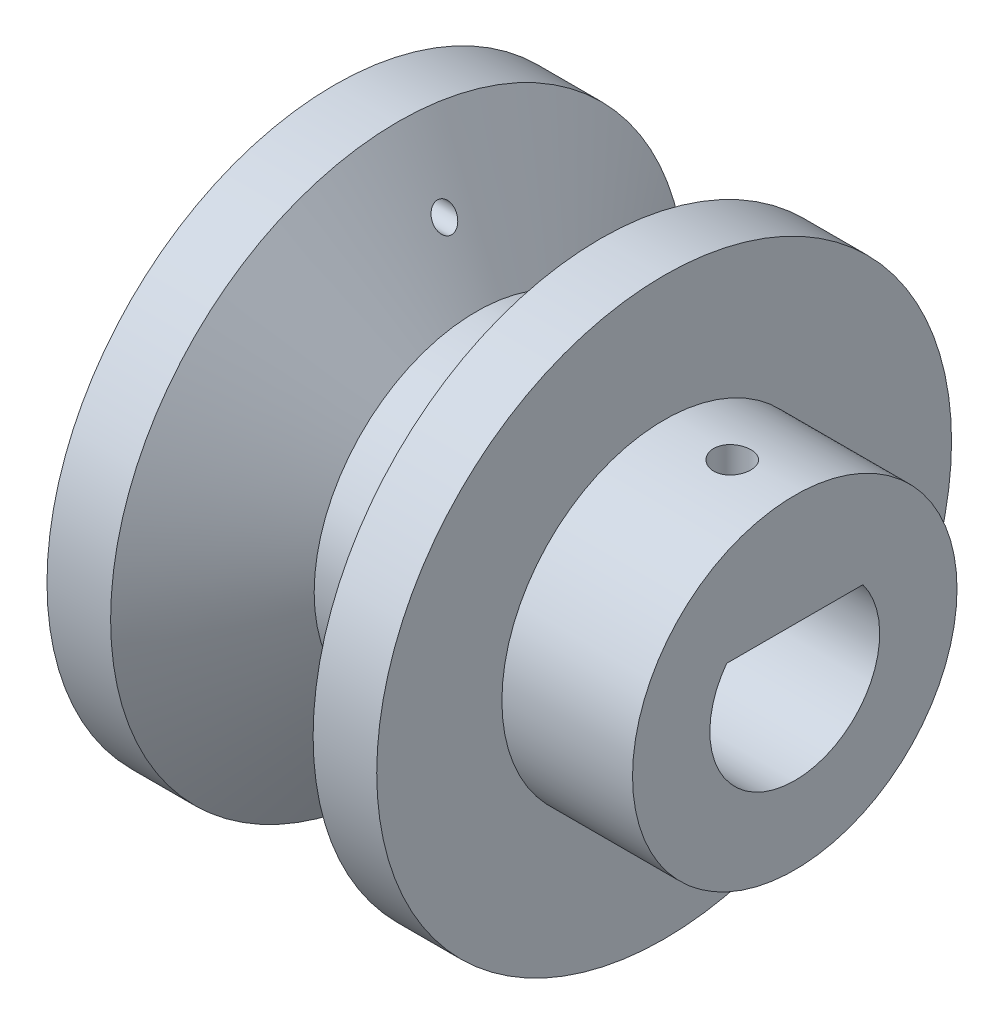
ISO-10303-21;
HEADER;
FILE_DESCRIPTION(('STEP AP214'),'2;1');
FILE_NAME('part.step','',(''),(''),'','','');
FILE_SCHEMA(('AUTOMOTIVE_DESIGN { 1 0 10303 214 1 1 1 1 }'));
ENDSEC;
DATA;
#1=APPLICATION_CONTEXT('core data for automotive mechanical design processes');
#2=APPLICATION_PROTOCOL_DEFINITION('international standard','automotive_design',2000,#1);
#3=PRODUCT_CONTEXT('',#1,'mechanical');
#4=PRODUCT('Part','Part','',(#3));
#5=PRODUCT_RELATED_PRODUCT_CATEGORY('part','',(#4));
#6=PRODUCT_DEFINITION_FORMATION('','',#4);
#7=PRODUCT_DEFINITION_CONTEXT('part definition',#1,'design');
#8=PRODUCT_DEFINITION('design','',#6,#7);
#9=PRODUCT_DEFINITION_SHAPE('','',#8);
#10=(LENGTH_UNIT() NAMED_UNIT(*) SI_UNIT(.MILLI.,.METRE.));
#11=(NAMED_UNIT(*) PLANE_ANGLE_UNIT() SI_UNIT($,.RADIAN.));
#12=(NAMED_UNIT(*) SI_UNIT($,.STERADIAN.) SOLID_ANGLE_UNIT());
#13=UNCERTAINTY_MEASURE_WITH_UNIT(LENGTH_MEASURE(1.E-05),#10,'distance_accuracy_value','');
#14=(GEOMETRIC_REPRESENTATION_CONTEXT(3) GLOBAL_UNCERTAINTY_ASSIGNED_CONTEXT((#13)) GLOBAL_UNIT_ASSIGNED_CONTEXT((#10,
#11,#12)) REPRESENTATION_CONTEXT('',''));
#15=CARTESIAN_POINT('',(0.,0.,0.));
#16=DIRECTION('',(0.,0.,1.));
#17=DIRECTION('',(1.,0.,0.));
#18=AXIS2_PLACEMENT_3D('',#15,#16,#17);
#19=CARTESIAN_POINT('',(-743.156397809563,0.,0.));
#20=DIRECTION('',(-1.,0.,0.));
#21=DIRECTION('',(0.,0.,1.));
#22=AXIS2_PLACEMENT_3D('',#19,#20,#21);
#23=CYLINDRICAL_SURFACE('',#22,12.4188584474886);
#24=CARTESIAN_POINT('',(25.24,0.,0.));
#25=DIRECTION('',(-1.,0.,0.));
#26=DIRECTION('',(0.,0.,1.));
#27=AXIS2_PLACEMENT_3D('',#24,#25,#26);
#28=CIRCLE('',#27,12.4188584474886);
#29=CARTESIAN_POINT('',(25.24,0.,12.4188584474886));
#30=VERTEX_POINT('',#29);
#31=EDGE_CURVE('E118',#30,#30,#28,.T.);
#32=ORIENTED_EDGE('',*,*,#31,.F.);
#33=EDGE_LOOP('',(#32));
#34=FACE_BOUND('',#33,.T.);
#35=CARTESIAN_POINT('',(35.2400000000001,0.,0.));
#36=DIRECTION('',(-1.,0.,0.));
#37=DIRECTION('',(0.,0.,1.));
#38=AXIS2_PLACEMENT_3D('',#35,#36,#37);
#39=CIRCLE('',#38,12.4188584474886);
#40=CARTESIAN_POINT('',(35.2400000000001,0.,12.4188584474886));
#41=VERTEX_POINT('',#40);
#42=EDGE_CURVE('E67',#41,#41,#39,.T.);
#43=ORIENTED_EDGE('',*,*,#42,.T.);
#44=EDGE_LOOP('',(#43));
#45=FACE_BOUND('',#44,.T.);
#46=CARTESIAN_POINT('',(30.4564854289592,12.3368318517665,-1.425));
#47=CARTESIAN_POINT('',(30.3767257499112,12.3368329133711,-1.42499657940768));
#48=CARTESIAN_POINT('',(30.2969149572835,12.3376136863085,-1.41828099475576));
#49=CARTESIAN_POINT('',(30.1395108596578,12.3406515638596,-1.39159530948965));
#50=CARTESIAN_POINT('',(30.0619200198907,12.3429102479605,-1.37161102789085));
#51=CARTESIAN_POINT('',(29.9112577874303,12.3486448171361,-1.31898166289413));
#52=CARTESIAN_POINT('',(29.8381835059513,12.3521199145139,-1.28634477131499));
#53=CARTESIAN_POINT('',(29.6985640561898,12.3598947973339,-1.20935341554239));
#54=CARTESIAN_POINT('',(29.6320176961543,12.3641944318215,-1.16500109562542));
#55=CARTESIAN_POINT('',(29.5070131445111,12.3731567524271,-1.06561248032776));
#56=CARTESIAN_POINT('',(29.4485903258798,12.3778208961618,-1.01053182188644));
#57=CARTESIAN_POINT('',(29.3417964245483,12.3869735478217,-0.891345331523106));
#58=CARTESIAN_POINT('',(29.2934258240568,12.3914620473129,-0.82723906688658));
#59=CARTESIAN_POINT('',(29.2079842957793,12.3997724055645,-0.691600902812646));
#60=CARTESIAN_POINT('',(29.1709451119469,12.4035923789432,-0.620048881804373));
#61=CARTESIAN_POINT('',(29.1094210305223,12.4101193173047,-0.471689370812507));
#62=CARTESIAN_POINT('',(29.0849357370614,12.412826317383,-0.39488204663382));
#63=CARTESIAN_POINT('',(29.0493194313203,12.4168120500806,-0.2385524353859));
#64=CARTESIAN_POINT('',(29.0381298619549,12.4180970437743,-0.159043651449833));
#65=CARTESIAN_POINT('',(29.0292412844435,12.4191153254379,0.00073293853604236));
#66=CARTESIAN_POINT('',(29.0315418244897,12.4188486653754,0.0810007190758064));
#67=CARTESIAN_POINT('',(29.0495209710596,12.4167987754947,0.239618781276121));
#68=CARTESIAN_POINT('',(29.0651366061689,12.4150226843971,0.317976305856592));
#69=CARTESIAN_POINT('',(29.1092043815446,12.4101615872632,0.470951088795022));
#70=CARTESIAN_POINT('',(29.1376567328166,12.407076559711,0.545568285648308));
#71=CARTESIAN_POINT('',(29.2066581539982,12.3999320078828,0.689140804027382));
#72=CARTESIAN_POINT('',(29.247234743039,12.3958702708476,0.758082785188274));
#73=CARTESIAN_POINT('',(29.3393128188616,12.3872273142073,0.88820232006709));
#74=CARTESIAN_POINT('',(29.3908147279536,12.3826460745244,0.94937957349907));
#75=CARTESIAN_POINT('',(29.5036348311036,12.3734462821445,1.06260252715065));
#76=CARTESIAN_POINT('',(29.5650078626871,12.3688276665266,1.11459359518068));
#77=CARTESIAN_POINT('',(29.695638917748,12.360099835848,1.20754445906353));
#78=CARTESIAN_POINT('',(29.7648969594604,12.3559906219654,1.24850422940446));
#79=CARTESIAN_POINT('',(29.9093778038213,12.3487467491065,1.31823143785395));
#80=CARTESIAN_POINT('',(29.9846025237183,12.3456124049862,1.34699493799039));
#81=CARTESIAN_POINT('',(30.1388580694797,12.3406794798589,1.39146695547265));
#82=CARTESIAN_POINT('',(30.2178887414818,12.3388808449016,1.40717600009979));
#83=CARTESIAN_POINT('',(30.3770315604316,12.3368326501637,1.42502174201459));
#84=CARTESIAN_POINT('',(30.4571349998753,12.3365743380775,1.42723512494755));
#85=CARTESIAN_POINT('',(30.6165715697792,12.3376129137197,1.41822863883146));
#86=CARTESIAN_POINT('',(30.6959047139934,12.3389097736282,1.40700901007953));
#87=CARTESIAN_POINT('',(30.8513216583303,12.3429045962443,1.37151937565863));
#88=CARTESIAN_POINT('',(30.9274139607357,12.3455986125934,1.34728612101101));
#89=CARTESIAN_POINT('',(31.0744544808436,12.3520810053482,1.2864948213467));
#90=CARTESIAN_POINT('',(31.1454025449013,12.3558694144237,1.24993640839458));
#91=CARTESIAN_POINT('',(31.2804887159006,12.3641348038081,1.16534245351547));
#92=CARTESIAN_POINT('',(31.3445950000162,12.3686147832308,1.11725639215174));
#93=CARTESIAN_POINT('',(31.4638540427252,12.3777489518294,1.01104397454608));
#94=CARTESIAN_POINT('',(31.5190065085811,12.3824031466951,0.952917290162512));
#95=CARTESIAN_POINT('',(31.6190595691407,12.391388028001,0.827939639666356));
#96=CARTESIAN_POINT('',(31.6639099315959,12.3957170628172,0.761048323719448));
#97=CARTESIAN_POINT('',(31.7417389129453,12.4035394603605,0.620637767626422));
#98=CARTESIAN_POINT('',(31.7747177383595,12.4070328376246,0.547118642807097));
#99=CARTESIAN_POINT('',(31.8277835988038,12.4127829306566,0.395709993026882));
#100=CARTESIAN_POINT('',(31.8479002338612,12.4150424840855,0.317830954505692));
#101=CARTESIAN_POINT('',(31.8747671119726,12.4180820657931,0.159773113564102));
#102=CARTESIAN_POINT('',(31.8815178582977,12.4188621497788,0.079594397849697));
#103=CARTESIAN_POINT('',(31.8814529500091,12.4188547393977,-0.0802950885669404));
#104=CARTESIAN_POINT('',(31.8747149767885,12.4180762210039,-0.160005902480762));
#105=CARTESIAN_POINT('',(31.8480277094297,12.415056853226,-0.317154733881952));
#106=CARTESIAN_POINT('',(31.8280784150618,12.4128160038164,-0.394592751329819));
#107=CARTESIAN_POINT('',(31.7755579684493,12.4071227858608,-0.544991747047911));
#108=CARTESIAN_POINT('',(31.7429899181853,12.4036707150804,-0.617953820506268));
#109=CARTESIAN_POINT('',(31.6661645255443,12.3959384159516,-0.75738886621984));
#110=CARTESIAN_POINT('',(31.6219071336962,12.3916581840982,-0.823861811010476));
#111=CARTESIAN_POINT('',(31.5226700027382,12.3827186423284,-0.948829254199049));
#112=CARTESIAN_POINT('',(31.467632389497,12.3780573691765,-1.00727765604996));
#113=CARTESIAN_POINT('',(31.3485155397673,12.3688972621374,-1.11414098134163));
#114=CARTESIAN_POINT('',(31.2844341537388,12.3643984671886,-1.16255351266552));
#115=CARTESIAN_POINT('',(31.1488121221897,12.3560569873039,-1.248102567477));
#116=CARTESIAN_POINT('',(31.0772477565124,12.3522164972766,-1.28520167836356));
#117=CARTESIAN_POINT('',(30.928903351869,12.345652310071,-1.34680458360956));
#118=CARTESIAN_POINT('',(30.8521291845959,12.3429273791966,-1.3713222993735));
#119=CARTESIAN_POINT('',(30.7218648912295,12.3395757069605,-1.40108938447031));
#120=CARTESIAN_POINT('',(30.6692015891652,12.3385517715773,-1.41004325414405));
#121=CARTESIAN_POINT('',(30.5631949591413,12.3371794908549,-1.42199968838362));
#122=CARTESIAN_POINT('',(30.5098516352658,12.33683114146,-1.42500228867566));
#123=CARTESIAN_POINT('',(30.4564854289592,12.3368318517665,-1.425));
#124=B_SPLINE_CURVE_WITH_KNOTS('',3,(#46,#47,#48,#49,#50,#51,#52,#53,#54,#55,#56,#57,#58,#59,
#60,#61,#62,#63,#64,#65,#66,#67,#68,#69,#70,#71,#72,#73,#74,#75,#76,#77,#78,#79,#80,#81,#82,#83,
#84,#85,#86,#87,#88,#89,#90,#91,#92,#93,#94,#95,#96,#97,#98,#99,#100,#101,#102,#103,#104,#105,
#106,#107,#108,#109,#110,#111,#112,#113,#114,#115,#116,#117,#118,#119,#120,#121,#122,#123),
.UNSPECIFIED.,.T.,.F.,(4,2,2,2,2,2,2,2,2,2,2,2,2,2,2,2,2,2,2,2,2,2,2,2,2,2,2,2,2,2,2,2,2,2,2,2,
2,2,4),(0.,0.239084113970291,0.47842416244864,0.717609510454033,0.956751110629616,
1.19690343157921,1.43706727007133,1.67789787209591,1.91872087941136,2.15847927458442,
2.39822963986687,2.6368523968479,2.87547907637379,3.11465154999251,3.35383327033116,
3.59439279236069,3.83495287072291,4.07559056288234,4.31621853499452,4.55547791628173,
4.79473301762935,5.03331597870293,5.27190606267891,5.51156151327294,5.75122479762523,
5.99203296450881,6.2328369420327,6.47308473854736,6.71332348874382,6.9521826866107,
7.19104188862912,7.42984241077516,7.66864394357645,7.90876448490876,8.14894219493541,
8.38990574984684,8.63060209878421,8.79057125735737,8.95053945561286),.UNSPECIFIED.);
#125=CARTESIAN_POINT('',(30.4564854289592,12.3368318517665,-1.425));
#126=VERTEX_POINT('',#125);
#127=EDGE_CURVE('E74',#126,#126,#124,.T.);
#128=ORIENTED_EDGE('',*,*,#127,.F.);
#129=EDGE_LOOP('',(#128));
#130=FACE_BOUND('',#129,.T.);
#131=ADVANCED_FACE('F32',(#34,#45,#130),#23,.T.);
#132=CARTESIAN_POINT('',(0.23999999999999,0.,0.));
#133=DIRECTION('',(1.,0.,0.));
#134=DIRECTION('',(0.,0.,-1.));
#135=AXIS2_PLACEMENT_3D('',#132,#133,#134);
#136=CYLINDRICAL_SURFACE('',#135,6.5);
#137=CARTESIAN_POINT('',(35.24,0.,0.));
#138=DIRECTION('',(1.,0.,0.));
#139=DIRECTION('',(0.,0.,-1.));
#140=AXIS2_PLACEMENT_3D('',#137,#138,#139);
#141=CIRCLE('',#140,6.5);
#142=CARTESIAN_POINT('',(35.24,3.88253725690177,5.21305135681298));
#143=VERTEX_POINT('',#142);
#144=CARTESIAN_POINT('',(35.24,3.88253725690177,-5.21305135681298));
#145=VERTEX_POINT('',#144);
#146=EDGE_CURVE('E57',#143,#145,#141,.T.);
#147=ORIENTED_EDGE('',*,*,#146,.T.);
#148=DIRECTION('',(1.,0.,0.));
#149=VECTOR('',#148,1.);
#150=CARTESIAN_POINT('',(0.23999999999999,3.88253725690177,-5.21305135681298));
#151=LINE('',#150,#149);
#152=CARTESIAN_POINT('',(0.23999999999999,3.88253725690177,-5.21305135681298));
#153=VERTEX_POINT('',#152);
#154=EDGE_CURVE('E69',#145,#153,#151,.F.);
#155=ORIENTED_EDGE('',*,*,#154,.T.);
#156=CARTESIAN_POINT('',(0.23999999999999,0.,0.));
#157=DIRECTION('',(1.,0.,0.));
#158=DIRECTION('',(0.,0.,-1.));
#159=AXIS2_PLACEMENT_3D('',#156,#157,#158);
#160=CIRCLE('',#159,6.5);
#161=CARTESIAN_POINT('',(0.23999999999999,3.88253725690177,5.21305135681298));
#162=VERTEX_POINT('',#161);
#163=EDGE_CURVE('E65',#162,#153,#160,.T.);
#164=ORIENTED_EDGE('',*,*,#163,.F.);
#165=DIRECTION('',(1.,0.,0.));
#166=VECTOR('',#165,1.);
#167=CARTESIAN_POINT('',(0.23999999999999,3.88253725690177,5.21305135681298));
#168=LINE('',#167,#166);
#169=EDGE_CURVE('E53',#162,#143,#168,.T.);
#170=ORIENTED_EDGE('',*,*,#169,.T.);
#171=EDGE_LOOP('',(#147,#155,#164,#170));
#172=FACE_BOUND('',#171,.T.);
#173=ADVANCED_FACE('F70',(#172),#136,.F.);
#174=CARTESIAN_POINT('',(0.,0.,0.));
#175=DIRECTION('',(1.,0.,0.));
#176=DIRECTION('',(0.,0.,-1.));
#177=AXIS2_PLACEMENT_3D('',#174,#175,#176);
#178=PLANE('',#177);
#179=CARTESIAN_POINT('',(0.,17.0038882596721,-0.435299539447605));
#180=DIRECTION('',(-1.,0.,0.));
#181=DIRECTION('',(0.,0.,1.));
#182=AXIS2_PLACEMENT_3D('',#179,#180,#181);
#183=CIRCLE('',#182,0.877374271185562);
#184=CARTESIAN_POINT('',(0.,17.0038882596721,0.442074731737957));
#185=VERTEX_POINT('',#184);
#186=EDGE_CURVE('E128',#185,#185,#183,.T.);
#187=ORIENTED_EDGE('',*,*,#186,.F.);
#188=EDGE_LOOP('',(#187));
#189=FACE_BOUND('',#188,.T.);
#190=CARTESIAN_POINT('',(0.,0.,0.));
#191=DIRECTION('',(-1.,0.,0.));
#192=DIRECTION('',(0.,0.,1.));
#193=AXIS2_PLACEMENT_3D('',#190,#191,#192);
#194=CIRCLE('',#193,22.);
#195=CARTESIAN_POINT('',(0.,0.,22.));
#196=VERTEX_POINT('',#195);
#197=EDGE_CURVE('E45',#196,#196,#194,.T.);
#198=ORIENTED_EDGE('',*,*,#197,.T.);
#199=EDGE_LOOP('',(#198));
#200=FACE_BOUND('',#199,.T.);
#201=ADVANCED_FACE('F34',(#189,#200),#178,.F.);
#202=CARTESIAN_POINT('',(-743.156397809563,0.,0.));
#203=DIRECTION('',(-1.,0.,0.));
#204=DIRECTION('',(0.,0.,1.));
#205=AXIS2_PLACEMENT_3D('',#202,#203,#204);
#206=CYLINDRICAL_SURFACE('',#205,22.);
#207=ORIENTED_EDGE('',*,*,#197,.F.);
#208=EDGE_LOOP('',(#207));
#209=FACE_BOUND('',#208,.T.);
#210=CARTESIAN_POINT('',(4.87000000000004,0.,0.));
#211=DIRECTION('',(-1.,0.,0.));
#212=DIRECTION('',(0.,0.,1.));
#213=AXIS2_PLACEMENT_3D('',#210,#211,#212);
#214=CIRCLE('',#213,22.);
#215=CARTESIAN_POINT('',(4.87000000000004,0.,22.));
#216=VERTEX_POINT('',#215);
#217=EDGE_CURVE('E132',#216,#216,#214,.T.);
#218=ORIENTED_EDGE('',*,*,#217,.T.);
#219=EDGE_LOOP('',(#218));
#220=FACE_BOUND('',#219,.T.);
#221=ADVANCED_FACE('F168',(#209,#220),#206,.T.);
#222=CARTESIAN_POINT('',(10.87,0.,0.));
#223=DIRECTION('',(-1.,0.,0.));
#224=DIRECTION('',(0.,0.,1.));
#225=AXIS2_PLACEMENT_3D('',#222,#223,#224);
#226=CONICAL_SURFACE('',#225,12.4188584474886,1.01131287661841);
#227=CARTESIAN_POINT('',(7.57710064935121,17.6469899885848,-1.0321293125052));
#228=CARTESIAN_POINT('',(7.59858696970687,17.6103093572041,-1.07165012340615));
#229=CARTESIAN_POINT('',(7.62208547211646,17.570493891253,-1.10722647006451));
#230=CARTESIAN_POINT('',(7.67211574976536,17.4863575017174,-1.16999423439249));
#231=CARTESIAN_POINT('',(7.69865373989293,17.4420273681804,-1.19716803614218));
#232=CARTESIAN_POINT('',(7.7537178680254,17.3506790615454,-1.24283461884535));
#233=CARTESIAN_POINT('',(7.7822317512725,17.3036777343423,-1.26137621827307));
#234=CARTESIAN_POINT('',(7.84063094326776,17.2080482814304,-1.29004924996073));
#235=CARTESIAN_POINT('',(7.87051579202427,17.1594207028306,-1.30018348162644));
#236=CARTESIAN_POINT('',(7.9345889447417,17.0558396084734,-1.31286398770481));
#237=CARTESIAN_POINT('',(7.96886969232172,17.0008153123109,-1.31437651309146));
#238=CARTESIAN_POINT('',(8.0375102749212,16.8914365160545,-1.30716416879393));
#239=CARTESIAN_POINT('',(8.07187015314245,16.8370826542982,-1.2984302048489));
#240=CARTESIAN_POINT('',(8.14175788271561,16.7273328415289,-1.26998626133393));
#241=CARTESIAN_POINT('',(8.17723632786973,16.6720622102294,-1.24966357055881));
#242=CARTESIAN_POINT('',(8.24606670152021,16.565678611003,-1.19770038677462));
#243=CARTESIAN_POINT('',(8.27942078309851,16.5145614185143,-1.16607157492409));
#244=CARTESIAN_POINT('',(8.33585911246015,16.428780982538,-1.09962176736246));
#245=CARTESIAN_POINT('',(8.35961996463377,16.392928982425,-1.0669056020117));
#246=CARTESIAN_POINT('',(8.40409237990411,16.3263132496161,-0.994836558175923));
#247=CARTESIAN_POINT('',(8.42480501157602,16.2955477333484,-0.955486015847686));
#248=CARTESIAN_POINT('',(8.46234495671956,16.2402844415044,-0.870373471187866));
#249=CARTESIAN_POINT('',(8.47913899447736,16.2158401675624,-0.824561508898873));
#250=CARTESIAN_POINT('',(8.50751309777022,16.1751081791058,-0.727953349369449));
#251=CARTESIAN_POINT('',(8.51909933119994,16.1588108131707,-0.677163135495156));
#252=CARTESIAN_POINT('',(8.53488094318649,16.1373447706426,-0.580161290511711));
#253=CARTESIAN_POINT('',(8.53990959326869,16.1308968261673,-0.534366853182571));
#254=CARTESIAN_POINT('',(8.54514520828514,16.1253259133949,-0.442070829258393));
#255=CARTESIAN_POINT('',(8.54535555018206,16.1261978143204,-0.395569760787498));
#256=CARTESIAN_POINT('',(8.541173254549,16.1347714102407,-0.308212439494241));
#257=CARTESIAN_POINT('',(8.53724514153672,16.1417716835689,-0.267261878949982));
#258=CARTESIAN_POINT('',(8.52572113922937,16.1613015180637,-0.187249414051404));
#259=CARTESIAN_POINT('',(8.51812522544573,16.1738311161475,-0.148187522308952));
#260=CARTESIAN_POINT('',(8.49946671631706,16.2041463988323,-0.0721051969150272));
#261=CARTESIAN_POINT('',(8.48833748769769,16.2220327014612,-0.0351416028744495));
#262=CARTESIAN_POINT('',(8.46316519283135,16.2622293004421,0.0352008745332211));
#263=CARTESIAN_POINT('',(8.44912110231585,16.2845411517882,0.0685784915312397));
#264=CARTESIAN_POINT('',(8.41687995595704,16.3356201580455,0.134920692963254));
#265=CARTESIAN_POINT('',(8.39839123806896,16.3648343176043,0.167398069752422));
#266=CARTESIAN_POINT('',(8.35909075464078,16.4268787201235,0.227045166224027));
#267=CARTESIAN_POINT('',(8.33827774400546,16.4597109010879,0.254212019485613));
#268=CARTESIAN_POINT('',(8.29144308012003,16.5336181920161,0.307000212991373));
#269=CARTESIAN_POINT('',(8.26512022814534,16.5751726474867,0.331683259220349));
#270=CARTESIAN_POINT('',(8.21089391937303,16.6608928082891,0.373663246172801));
#271=CARTESIAN_POINT('',(8.18298954721767,16.7050600265054,0.390955858954056));
#272=CARTESIAN_POINT('',(8.12201915890138,16.8017439443856,0.420175566971032));
#273=CARTESIAN_POINT('',(8.08880293035609,16.8545251252543,0.430921399006398));
#274=CARTESIAN_POINT('',(8.02199430711081,16.9609411585357,0.442658189173514));
#275=CARTESIAN_POINT('',(7.98840172781309,17.0145764358469,0.443644129778204));
#276=CARTESIAN_POINT('',(7.91896479247929,17.1257041049629,0.435500590064853));
#277=CARTESIAN_POINT('',(7.88315557748009,17.1831613604048,0.425554610851169));
#278=CARTESIAN_POINT('',(7.81305828477654,17.2958753262745,0.394129215887979));
#279=CARTESIAN_POINT('',(7.77877078551657,17.3511311990956,0.372645454294588));
#280=CARTESIAN_POINT('',(7.71379193642469,17.4559806321318,0.318872018137825));
#281=CARTESIAN_POINT('',(7.68302779815533,17.5056878491033,0.28689452421742));
#282=CARTESIAN_POINT('',(7.62533406909833,17.5988866125941,0.212242419926597));
#283=CARTESIAN_POINT('',(7.59839716090936,17.6423900209737,0.16958866531187));
#284=CARTESIAN_POINT('',(7.5564280952465,17.7099770138339,0.0874194493949479));
#285=CARTESIAN_POINT('',(7.54015272745725,17.7361211723733,0.05022045362308));
#286=CARTESIAN_POINT('',(7.51098112956783,17.7827514763873,-0.0287820108125972));
#287=CARTESIAN_POINT('',(7.49808283855765,17.8032410730546,-0.070582649027154));
#288=CARTESIAN_POINT('',(7.47619126189893,17.8376387364044,-0.158053701708577));
#289=CARTESIAN_POINT('',(7.46721856973529,17.8515121282323,-0.203743056567755));
#290=CARTESIAN_POINT('',(7.45376732766192,17.8716796013603,-0.297406287042948));
#291=CARTESIAN_POINT('',(7.44928674611258,17.877977109251,-0.345379119621681));
#292=CARTESIAN_POINT('',(7.44527865397654,17.8823537747537,-0.437381731517052));
#293=CARTESIAN_POINT('',(7.44532706194515,17.8811465326982,-0.481360625106139));
#294=CARTESIAN_POINT('',(7.44932520956757,17.8722015880745,-0.568465213747448));
#295=CARTESIAN_POINT('',(7.45327455246623,17.8644645496485,-0.611590995112756));
#296=CARTESIAN_POINT('',(7.46471441193906,17.8431470686332,-0.694558804795008));
#297=CARTESIAN_POINT('',(7.47210323596792,17.8297353786481,-0.7344588381032));
#298=CARTESIAN_POINT('',(7.49006154336463,17.7976971406007,-0.811311988945838));
#299=CARTESIAN_POINT('',(7.50062971839938,17.7790727378383,-0.848266310770904));
#300=CARTESIAN_POINT('',(7.52181145146751,17.7421114658881,-0.910491405001787));
#301=CARTESIAN_POINT('',(7.53186311145677,17.7246808783704,-0.936502677841586));
#302=CARTESIAN_POINT('',(7.55342859947495,17.687498164192,-0.986140126297638));
#303=CARTESIAN_POINT('',(7.5649424808183,17.6677459528839,-1.00976621489066));
#304=CARTESIAN_POINT('',(7.57710064935121,17.6469899885848,-1.0321293125052));
#305=B_SPLINE_CURVE_WITH_KNOTS('',3,(#227,#228,#229,#230,#231,#232,#233,#234,#235,#236,#237,
#238,#239,#240,#241,#242,#243,#244,#245,#246,#247,#248,#249,#250,#251,#252,#253,#254,#255,#256,
#257,#258,#259,#260,#261,#262,#263,#264,#265,#266,#267,#268,#269,#270,#271,#272,#273,#274,#275,
#276,#277,#278,#279,#280,#281,#282,#283,#284,#285,#286,#287,#288,#289,#290,#291,#292,#293,#294,
#295,#296,#297,#298,#299,#300,#301,#302,#303,#304),.UNSPECIFIED.,.T.,.F.,(4,2,2,2,2,2,2,2,2,2,2,
2,2,2,2,2,2,2,2,2,2,2,2,2,2,2,2,2,2,2,2,2,2,2,2,2,2,2,4),(0.,0.173996351568271,
0.348355050897355,0.521715332761506,0.695017867564551,0.888722524279778,1.08259923350639,
1.28782754899418,1.49284443845302,1.65431677774408,1.8157323762386,1.97847247612174,
2.1410193226121,2.27978647529783,2.41845636856715,2.54306680311651,2.66767806965562,
2.79479488196885,2.92195643837835,3.06371467017267,3.20554920772108,3.37001542430504,
3.53457782309115,3.72362696343585,3.91277328825767,4.11706890577917,4.32144152771644,
4.52021486035198,4.71860288500816,4.86288734801061,5.00708355300821,5.15202738932061,
5.29690564250678,5.42823286153829,5.55954672495499,5.68720322986764,5.81480727460697,
5.91326060580393,6.01171752776455),.UNSPECIFIED.);
#306=CARTESIAN_POINT('',(7.57710064935121,17.6469899885848,-1.0321293125052));
#307=VERTEX_POINT('',#306);
#308=EDGE_CURVE('E36',#307,#307,#305,.T.);
#309=ORIENTED_EDGE('',*,*,#308,.T.);
#310=EDGE_LOOP('',(#309));
#311=FACE_BOUND('',#310,.T.);
#312=ORIENTED_EDGE('',*,*,#217,.F.);
#313=EDGE_LOOP('',(#312));
#314=FACE_BOUND('',#313,.T.);
#315=CARTESIAN_POINT('',(10.87,0.,0.));
#316=DIRECTION('',(-1.,0.,0.));
#317=DIRECTION('',(0.,0.,1.));
#318=AXIS2_PLACEMENT_3D('',#315,#316,#317);
#319=CIRCLE('',#318,12.4188584474886);
#320=CARTESIAN_POINT('',(10.87,0.,12.4188584474886));
#321=VERTEX_POINT('',#320);
#322=EDGE_CURVE('E135',#321,#321,#319,.T.);
#323=ORIENTED_EDGE('',*,*,#322,.T.);
#324=EDGE_LOOP('',(#323));
#325=FACE_BOUND('',#324,.T.);
#326=ADVANCED_FACE('F164',(#311,#314,#325),#226,.T.);
#327=CARTESIAN_POINT('',(-743.156397809563,0.,0.));
#328=DIRECTION('',(-1.,0.,0.));
#329=DIRECTION('',(0.,0.,1.));
#330=AXIS2_PLACEMENT_3D('',#327,#328,#329);
#331=CYLINDRICAL_SURFACE('',#330,12.4188584474886);
#332=ORIENTED_EDGE('',*,*,#322,.F.);
#333=EDGE_LOOP('',(#332));
#334=FACE_BOUND('',#333,.T.);
#335=CARTESIAN_POINT('',(14.37,0.,0.));
#336=DIRECTION('',(-1.,0.,0.));
#337=DIRECTION('',(0.,0.,1.));
#338=AXIS2_PLACEMENT_3D('',#335,#336,#337);
#339=CIRCLE('',#338,12.4188584474886);
#340=CARTESIAN_POINT('',(14.37,0.,12.4188584474886));
#341=VERTEX_POINT('',#340);
#342=EDGE_CURVE('E138',#341,#341,#339,.T.);
#343=ORIENTED_EDGE('',*,*,#342,.T.);
#344=EDGE_LOOP('',(#343));
#345=FACE_BOUND('',#344,.T.);
#346=ADVANCED_FACE('F158',(#334,#345),#331,.T.);
#347=CARTESIAN_POINT('',(20.37,0.,0.));
#348=DIRECTION('',(1.,0.,0.));
#349=DIRECTION('',(0.,0.,-1.));
#350=AXIS2_PLACEMENT_3D('',#347,#348,#349);
#351=CONICAL_SURFACE('',#350,22.,1.01131287661841);
#352=ORIENTED_EDGE('',*,*,#342,.F.);
#353=EDGE_LOOP('',(#352));
#354=FACE_BOUND('',#353,.T.);
#355=CARTESIAN_POINT('',(20.37,0.,0.));
#356=DIRECTION('',(-1.,0.,0.));
#357=DIRECTION('',(0.,0.,1.));
#358=AXIS2_PLACEMENT_3D('',#355,#356,#357);
#359=CIRCLE('',#358,22.);
#360=CARTESIAN_POINT('',(20.37,0.,22.));
#361=VERTEX_POINT('',#360);
#362=EDGE_CURVE('E141',#361,#361,#359,.T.);
#363=ORIENTED_EDGE('',*,*,#362,.T.);
#364=EDGE_LOOP('',(#363));
#365=FACE_BOUND('',#364,.T.);
#366=ADVANCED_FACE('F152',(#354,#365),#351,.T.);
#367=CARTESIAN_POINT('',(-743.156397809563,0.,0.));
#368=DIRECTION('',(-1.,0.,0.));
#369=DIRECTION('',(0.,0.,1.));
#370=AXIS2_PLACEMENT_3D('',#367,#368,#369);
#371=CYLINDRICAL_SURFACE('',#370,22.);
#372=ORIENTED_EDGE('',*,*,#362,.F.);
#373=EDGE_LOOP('',(#372));
#374=FACE_BOUND('',#373,.T.);
#375=CARTESIAN_POINT('',(25.24,0.,0.));
#376=DIRECTION('',(-1.,0.,0.));
#377=DIRECTION('',(0.,0.,1.));
#378=AXIS2_PLACEMENT_3D('',#375,#376,#377);
#379=CIRCLE('',#378,22.);
#380=CARTESIAN_POINT('',(25.24,0.,22.));
#381=VERTEX_POINT('',#380);
#382=EDGE_CURVE('E144',#381,#381,#379,.T.);
#383=ORIENTED_EDGE('',*,*,#382,.T.);
#384=EDGE_LOOP('',(#383));
#385=FACE_BOUND('',#384,.T.);
#386=ADVANCED_FACE('F108',(#374,#385),#371,.T.);
#387=CARTESIAN_POINT('',(25.24,22.,0.));
#388=DIRECTION('',(-1.,0.,0.));
#389=DIRECTION('',(0.,0.,1.));
#390=AXIS2_PLACEMENT_3D('',#387,#388,#389);
#391=PLANE('',#390);
#392=ORIENTED_EDGE('',*,*,#382,.F.);
#393=EDGE_LOOP('',(#392));
#394=FACE_BOUND('',#393,.T.);
#395=ORIENTED_EDGE('',*,*,#31,.T.);
#396=EDGE_LOOP('',(#395));
#397=FACE_BOUND('',#396,.T.);
#398=ADVANCED_FACE('F103',(#394,#397),#391,.F.);
#399=CARTESIAN_POINT('',(35.24,12.4188584474886,0.));
#400=DIRECTION('',(-1.,0.,0.));
#401=DIRECTION('',(0.,0.,1.));
#402=AXIS2_PLACEMENT_3D('',#399,#400,#401);
#403=PLANE('',#402);
#404=ORIENTED_EDGE('',*,*,#146,.F.);
#405=DIRECTION('',(0.,0.,-1.));
#406=VECTOR('',#405,1.);
#407=CARTESIAN_POINT('',(35.24,3.88253725690177,5.90615650829075));
#408=LINE('',#407,#406);
#409=EDGE_CURVE('E77',#143,#145,#408,.T.);
#410=ORIENTED_EDGE('',*,*,#409,.T.);
#411=EDGE_LOOP('',(#404,#410));
#412=FACE_BOUND('',#411,.T.);
#413=ORIENTED_EDGE('',*,*,#42,.F.);
#414=EDGE_LOOP('',(#413));
#415=FACE_BOUND('',#414,.T.);
#416=ADVANCED_FACE('F100',(#412,#415),#403,.F.);
#417=CARTESIAN_POINT('',(0.23999999999999,0.,0.));
#418=DIRECTION('',(1.,0.,0.));
#419=DIRECTION('',(0.,0.,-1.));
#420=AXIS2_PLACEMENT_3D('',#417,#418,#419);
#421=PLANE('',#420);
#422=DIRECTION('',(0.,0.,-1.));
#423=VECTOR('',#422,1.);
#424=CARTESIAN_POINT('',(0.23999999999999,3.88253725690177,0.));
#425=LINE('',#424,#423);
#426=EDGE_CURVE('E11',#162,#153,#425,.T.);
#427=ORIENTED_EDGE('',*,*,#426,.F.);
#428=ORIENTED_EDGE('',*,*,#163,.T.);
#429=EDGE_LOOP('',(#427,#428));
#430=FACE_BOUND('',#429,.T.);
#431=ADVANCED_FACE('F66',(#430),#421,.T.);
#432=CARTESIAN_POINT('',(30.4564854289592,14.,0.));
#433=DIRECTION('',(0.,-1.,0.));
#434=DIRECTION('',(0.,0.,-1.));
#435=AXIS2_PLACEMENT_3D('',#432,#433,#434);
#436=CYLINDRICAL_SURFACE('',#435,1.425);
#437=ORIENTED_EDGE('',*,*,#127,.T.);
#438=EDGE_LOOP('',(#437));
#439=FACE_BOUND('',#438,.T.);
#440=CARTESIAN_POINT('',(30.4564854289592,3.88253725690177,0.));
#441=DIRECTION('',(0.,-1.,0.));
#442=DIRECTION('',(0.,0.,-1.));
#443=AXIS2_PLACEMENT_3D('',#440,#441,#442);
#444=CIRCLE('',#443,1.425);
#445=CARTESIAN_POINT('',(30.4564854289592,3.88253725690177,-1.425));
#446=VERTEX_POINT('',#445);
#447=EDGE_CURVE('E79',#446,#446,#444,.T.);
#448=ORIENTED_EDGE('',*,*,#447,.T.);
#449=EDGE_LOOP('',(#448));
#450=FACE_BOUND('',#449,.T.);
#451=ADVANCED_FACE('F92',(#439,#450),#436,.F.);
#452=CARTESIAN_POINT('',(0.23999999999999,3.88253725690177,5.90615650829075));
#453=DIRECTION('',(0.,-1.,0.));
#454=DIRECTION('',(0.,0.,-1.));
#455=AXIS2_PLACEMENT_3D('',#452,#453,#454);
#456=PLANE('',#455);
#457=ORIENTED_EDGE('',*,*,#447,.F.);
#458=EDGE_LOOP('',(#457));
#459=FACE_BOUND('',#458,.T.);
#460=ORIENTED_EDGE('',*,*,#154,.F.);
#461=ORIENTED_EDGE('',*,*,#409,.F.);
#462=ORIENTED_EDGE('',*,*,#169,.F.);
#463=ORIENTED_EDGE('',*,*,#426,.T.);
#464=EDGE_LOOP('',(#460,#461,#462,#463));
#465=FACE_BOUND('',#464,.T.);
#466=ADVANCED_FACE('F76',(#459,#465),#456,.T.);
#467=CARTESIAN_POINT('',(12.,17.0038882596721,-0.435299539447605));
#468=DIRECTION('',(-1.,0.,0.));
#469=DIRECTION('',(0.,0.,1.));
#470=AXIS2_PLACEMENT_3D('',#467,#468,#469);
#471=CYLINDRICAL_SURFACE('',#470,0.877374271185562);
#472=ORIENTED_EDGE('',*,*,#186,.T.);
#473=EDGE_LOOP('',(#472));
#474=FACE_BOUND('',#473,.T.);
#475=ORIENTED_EDGE('',*,*,#308,.F.);
#476=EDGE_LOOP('',(#475));
#477=FACE_BOUND('',#476,.T.);
#478=ADVANCED_FACE('F191',(#474,#477),#471,.F.);
#479=CLOSED_SHELL('',(#131,#173,#201,#221,#326,#346,#366,#386,#398,#416,#431,#451,#466,#478));
#480=MANIFOLD_SOLID_BREP('B2',#479);
#481=ADVANCED_BREP_SHAPE_REPRESENTATION('',(#18,#480),#14);
#482=SHAPE_DEFINITION_REPRESENTATION(#9,#481);
ENDSEC;
END-ISO-10303-21;
